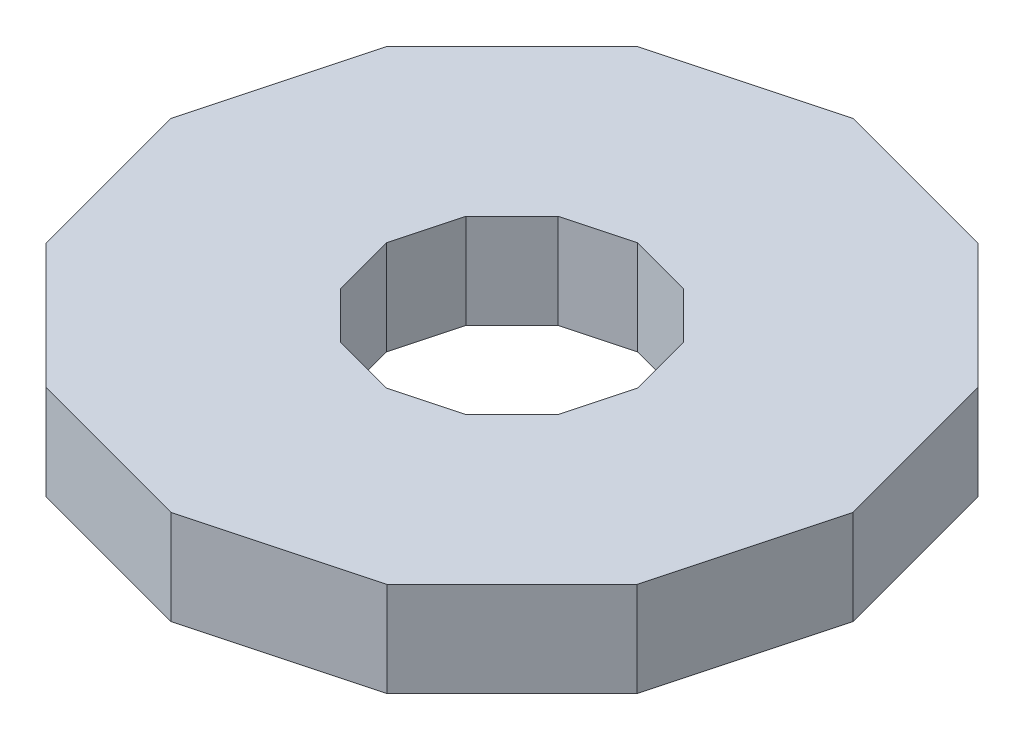
ISO-10303-21;
HEADER;
FILE_DESCRIPTION(('STEP AP214'),'2;1');
FILE_NAME('part.step','',(''),(''),'','','');
FILE_SCHEMA(('AUTOMOTIVE_DESIGN { 1 0 10303 214 1 1 1 1 }'));
ENDSEC;
DATA;
#1=APPLICATION_CONTEXT('core data for automotive mechanical design processes');
#2=APPLICATION_PROTOCOL_DEFINITION('international standard','automotive_design',2000,#1);
#3=PRODUCT_CONTEXT('',#1,'mechanical');
#4=PRODUCT('Part','Part','',(#3));
#5=PRODUCT_RELATED_PRODUCT_CATEGORY('part','',(#4));
#6=PRODUCT_DEFINITION_FORMATION('','',#4);
#7=PRODUCT_DEFINITION_CONTEXT('part definition',#1,'design');
#8=PRODUCT_DEFINITION('design','',#6,#7);
#9=PRODUCT_DEFINITION_SHAPE('','',#8);
#10=(LENGTH_UNIT() NAMED_UNIT(*) SI_UNIT(.MILLI.,.METRE.));
#11=(NAMED_UNIT(*) PLANE_ANGLE_UNIT() SI_UNIT($,.RADIAN.));
#12=(NAMED_UNIT(*) SI_UNIT($,.STERADIAN.) SOLID_ANGLE_UNIT());
#13=UNCERTAINTY_MEASURE_WITH_UNIT(LENGTH_MEASURE(1.E-05),#10,'distance_accuracy_value','');
#14=(GEOMETRIC_REPRESENTATION_CONTEXT(3) GLOBAL_UNCERTAINTY_ASSIGNED_CONTEXT((#13)) GLOBAL_UNIT_ASSIGNED_CONTEXT((#10,
#11,#12)) REPRESENTATION_CONTEXT('',''));
#15=CARTESIAN_POINT('',(0.,0.,0.));
#16=DIRECTION('',(0.,0.,1.));
#17=DIRECTION('',(1.,0.,0.));
#18=AXIS2_PLACEMENT_3D('',#15,#16,#17);
#19=CARTESIAN_POINT('',(0.,19.05,0.));
#20=DIRECTION('',(0.,1.,0.));
#21=DIRECTION('',(0.,0.,1.));
#22=AXIS2_PLACEMENT_3D('',#19,#20,#21);
#23=PLANE('',#22);
#24=DIRECTION('',(0.258819045102521,0.,-0.965925826289068));
#25=VECTOR('',#24,1.);
#26=CARTESIAN_POINT('',(59.4930395218328,19.05,34.3483223828393));
#27=LINE('',#26,#25);
#28=CARTESIAN_POINT('',(59.4930395218328,19.05,34.3483223828393));
#29=VERTEX_POINT('',#28);
#30=CARTESIAN_POINT('',(68.6966447656785,19.05,0.));
#31=VERTEX_POINT('',#30);
#32=EDGE_CURVE('E302',#29,#31,#27,.T.);
#33=ORIENTED_EDGE('',*,*,#32,.T.);
#34=DIRECTION('',(-0.258819045102521,0.,-0.965925826289068));
#35=VECTOR('',#34,1.);
#36=CARTESIAN_POINT('',(68.6966447656785,19.05,0.));
#37=LINE('',#36,#35);
#38=CARTESIAN_POINT('',(59.4930395218328,19.05,-34.3483223828392));
#39=VERTEX_POINT('',#38);
#40=EDGE_CURVE('E306',#31,#39,#37,.T.);
#41=ORIENTED_EDGE('',*,*,#40,.T.);
#42=DIRECTION('',(-0.707106781186548,0.,-0.707106781186547));
#43=VECTOR('',#42,1.);
#44=CARTESIAN_POINT('',(59.4930395218328,19.05,-34.3483223828392));
#45=LINE('',#44,#43);
#46=CARTESIAN_POINT('',(34.3483223828392,19.05,-59.4930395218329));
#47=VERTEX_POINT('',#46);
#48=EDGE_CURVE('E310',#39,#47,#45,.T.);
#49=ORIENTED_EDGE('',*,*,#48,.T.);
#50=DIRECTION('',(-0.965925826289068,0.,-0.258819045102521));
#51=VECTOR('',#50,1.);
#52=CARTESIAN_POINT('',(34.3483223828392,19.05,-59.4930395218329));
#53=LINE('',#52,#51);
#54=CARTESIAN_POINT('',(0.,19.05,-68.6966447656785));
#55=VERTEX_POINT('',#54);
#56=EDGE_CURVE('E313',#47,#55,#53,.T.);
#57=ORIENTED_EDGE('',*,*,#56,.T.);
#58=DIRECTION('',(-0.965925826289068,0.,0.258819045102521));
#59=VECTOR('',#58,1.);
#60=CARTESIAN_POINT('',(0.,19.05,-68.6966447656785));
#61=LINE('',#60,#59);
#62=CARTESIAN_POINT('',(-34.3483223828392,19.05,-59.4930395218328));
#63=VERTEX_POINT('',#62);
#64=EDGE_CURVE('E316',#55,#63,#61,.T.);
#65=ORIENTED_EDGE('',*,*,#64,.T.);
#66=DIRECTION('',(-0.707106781186547,0.,0.707106781186548));
#67=VECTOR('',#66,1.);
#68=CARTESIAN_POINT('',(-34.3483223828392,19.05,-59.4930395218328));
#69=LINE('',#68,#67);
#70=CARTESIAN_POINT('',(-59.4930395218328,19.05,-34.3483223828392));
#71=VERTEX_POINT('',#70);
#72=EDGE_CURVE('E318',#63,#71,#69,.T.);
#73=ORIENTED_EDGE('',*,*,#72,.T.);
#74=DIRECTION('',(-0.258819045102521,0.,0.965925826289068));
#75=VECTOR('',#74,1.);
#76=CARTESIAN_POINT('',(-59.4930395218328,19.05,-34.3483223828392));
#77=LINE('',#76,#75);
#78=CARTESIAN_POINT('',(-68.6966447656785,19.05,0.));
#79=VERTEX_POINT('',#78);
#80=EDGE_CURVE('E321',#71,#79,#77,.T.);
#81=ORIENTED_EDGE('',*,*,#80,.T.);
#82=DIRECTION('',(0.258819045102521,0.,0.965925826289068));
#83=VECTOR('',#82,1.);
#84=CARTESIAN_POINT('',(-68.6966447656785,19.05,0.));
#85=LINE('',#84,#83);
#86=CARTESIAN_POINT('',(-59.4930395218328,19.05,34.3483223828392));
#87=VERTEX_POINT('',#86);
#88=EDGE_CURVE('E324',#79,#87,#85,.T.);
#89=ORIENTED_EDGE('',*,*,#88,.T.);
#90=DIRECTION('',(0.707106781186547,0.,0.707106781186548));
#91=VECTOR('',#90,1.);
#92=CARTESIAN_POINT('',(-59.4930395218328,19.05,34.3483223828392));
#93=LINE('',#92,#91);
#94=CARTESIAN_POINT('',(-34.3483223828392,19.05,59.4930395218328));
#95=VERTEX_POINT('',#94);
#96=EDGE_CURVE('E326',#87,#95,#93,.T.);
#97=ORIENTED_EDGE('',*,*,#96,.T.);
#98=DIRECTION('',(0.965925826289068,0.,0.258819045102521));
#99=VECTOR('',#98,1.);
#100=CARTESIAN_POINT('',(-34.3483223828392,19.05,59.4930395218328));
#101=LINE('',#100,#99);
#102=CARTESIAN_POINT('',(0.,19.05,68.6966447656785));
#103=VERTEX_POINT('',#102);
#104=EDGE_CURVE('E329',#95,#103,#101,.T.);
#105=ORIENTED_EDGE('',*,*,#104,.T.);
#106=DIRECTION('',(0.965925826289068,0.,-0.258819045102521));
#107=VECTOR('',#106,1.);
#108=CARTESIAN_POINT('',(0.,19.05,68.6966447656785));
#109=LINE('',#108,#107);
#110=CARTESIAN_POINT('',(34.3483223828392,19.05,59.4930395218328));
#111=VERTEX_POINT('',#110);
#112=EDGE_CURVE('E331',#103,#111,#109,.T.);
#113=ORIENTED_EDGE('',*,*,#112,.T.);
#114=DIRECTION('',(0.707106781186548,0.,-0.707106781186547));
#115=VECTOR('',#114,1.);
#116=CARTESIAN_POINT('',(34.3483223828392,19.05,59.4930395218328));
#117=LINE('',#116,#115);
#118=EDGE_CURVE('E333',#111,#29,#117,.T.);
#119=ORIENTED_EDGE('',*,*,#118,.T.);
#120=EDGE_LOOP('',(#33,#41,#49,#57,#65,#73,#81,#89,#97,#105,#113,#119));
#121=FACE_BOUND('',#120,.T.);
#122=DIRECTION('',(-0.258819045102521,0.,-0.965925826289068));
#123=VECTOR('',#122,1.);
#124=CARTESIAN_POINT('',(25.3082200446919,19.05,0.));
#125=LINE('',#124,#123);
#126=CARTESIAN_POINT('',(25.3082200446919,19.05,0.));
#127=VERTEX_POINT('',#126);
#128=CARTESIAN_POINT('',(21.9175614832697,19.05,-12.6541100223459));
#129=VERTEX_POINT('',#128);
#130=EDGE_CURVE('E205',#127,#129,#125,.T.);
#131=ORIENTED_EDGE('',*,*,#130,.F.);
#132=DIRECTION('',(0.258819045102521,0.,-0.965925826289068));
#133=VECTOR('',#132,1.);
#134=CARTESIAN_POINT('',(21.9175614832697,19.05,12.6541100223459));
#135=LINE('',#134,#133);
#136=CARTESIAN_POINT('',(21.9175614832697,19.05,12.6541100223459));
#137=VERTEX_POINT('',#136);
#138=EDGE_CURVE('E196',#137,#127,#135,.T.);
#139=ORIENTED_EDGE('',*,*,#138,.F.);
#140=DIRECTION('',(0.707106781186547,0.,-0.707106781186548));
#141=VECTOR('',#140,1.);
#142=CARTESIAN_POINT('',(12.6541100223459,19.05,21.9175614832697));
#143=LINE('',#142,#141);
#144=CARTESIAN_POINT('',(12.6541100223459,19.05,21.9175614832697));
#145=VERTEX_POINT('',#144);
#146=EDGE_CURVE('E239',#145,#137,#143,.T.);
#147=ORIENTED_EDGE('',*,*,#146,.F.);
#148=DIRECTION('',(0.965925826289068,0.,-0.25881904510252));
#149=VECTOR('',#148,1.);
#150=CARTESIAN_POINT('',(0.,19.05,25.3082200446919));
#151=LINE('',#150,#149);
#152=CARTESIAN_POINT('',(0.,19.05,25.3082200446919));
#153=VERTEX_POINT('',#152);
#154=EDGE_CURVE('E237',#153,#145,#151,.T.);
#155=ORIENTED_EDGE('',*,*,#154,.F.);
#156=DIRECTION('',(0.965925826289068,0.,0.258819045102521));
#157=VECTOR('',#156,1.);
#158=CARTESIAN_POINT('',(-12.6541100223459,19.05,21.9175614832697));
#159=LINE('',#158,#157);
#160=CARTESIAN_POINT('',(-12.6541100223459,19.05,21.9175614832697));
#161=VERTEX_POINT('',#160);
#162=EDGE_CURVE('E235',#161,#153,#159,.T.);
#163=ORIENTED_EDGE('',*,*,#162,.F.);
#164=DIRECTION('',(0.707106781186547,0.,0.707106781186548));
#165=VECTOR('',#164,1.);
#166=CARTESIAN_POINT('',(-21.9175614832697,19.05,12.6541100223459));
#167=LINE('',#166,#165);
#168=CARTESIAN_POINT('',(-21.9175614832697,19.05,12.6541100223459));
#169=VERTEX_POINT('',#168);
#170=EDGE_CURVE('E233',#169,#161,#167,.T.);
#171=ORIENTED_EDGE('',*,*,#170,.F.);
#172=DIRECTION('',(0.258819045102521,0.,0.965925826289068));
#173=VECTOR('',#172,1.);
#174=CARTESIAN_POINT('',(-25.3082200446919,19.05,0.));
#175=LINE('',#174,#173);
#176=CARTESIAN_POINT('',(-25.3082200446919,19.05,0.));
#177=VERTEX_POINT('',#176);
#178=EDGE_CURVE('E231',#177,#169,#175,.T.);
#179=ORIENTED_EDGE('',*,*,#178,.F.);
#180=DIRECTION('',(-0.258819045102521,0.,0.965925826289068));
#181=VECTOR('',#180,1.);
#182=CARTESIAN_POINT('',(-21.9175614832697,19.05,-12.6541100223459));
#183=LINE('',#182,#181);
#184=CARTESIAN_POINT('',(-21.9175614832697,19.05,-12.6541100223459));
#185=VERTEX_POINT('',#184);
#186=EDGE_CURVE('E228',#185,#177,#183,.T.);
#187=ORIENTED_EDGE('',*,*,#186,.F.);
#188=DIRECTION('',(-0.707106781186547,0.,0.707106781186548));
#189=VECTOR('',#188,1.);
#190=CARTESIAN_POINT('',(-12.6541100223459,19.05,-21.9175614832697));
#191=LINE('',#190,#189);
#192=CARTESIAN_POINT('',(-12.6541100223459,19.05,-21.9175614832697));
#193=VERTEX_POINT('',#192);
#194=EDGE_CURVE('E226',#193,#185,#191,.T.);
#195=ORIENTED_EDGE('',*,*,#194,.F.);
#196=DIRECTION('',(-0.965925826289068,0.,0.258819045102521));
#197=VECTOR('',#196,1.);
#198=CARTESIAN_POINT('',(0.,19.05,-25.3082200446919));
#199=LINE('',#198,#197);
#200=CARTESIAN_POINT('',(0.,19.05,-25.3082200446919));
#201=VERTEX_POINT('',#200);
#202=EDGE_CURVE('E224',#201,#193,#199,.T.);
#203=ORIENTED_EDGE('',*,*,#202,.F.);
#204=DIRECTION('',(-0.965925826289068,0.,-0.258819045102521));
#205=VECTOR('',#204,1.);
#206=CARTESIAN_POINT('',(12.6541100223459,19.05,-21.9175614832697));
#207=LINE('',#206,#205);
#208=CARTESIAN_POINT('',(12.6541100223459,19.05,-21.9175614832697));
#209=VERTEX_POINT('',#208);
#210=EDGE_CURVE('E220',#209,#201,#207,.T.);
#211=ORIENTED_EDGE('',*,*,#210,.F.);
#212=DIRECTION('',(-0.707106781186548,0.,-0.707106781186547));
#213=VECTOR('',#212,1.);
#214=CARTESIAN_POINT('',(21.9175614832697,19.05,-12.6541100223459));
#215=LINE('',#214,#213);
#216=EDGE_CURVE('E218',#129,#209,#215,.T.);
#217=ORIENTED_EDGE('',*,*,#216,.F.);
#218=EDGE_LOOP('',(#131,#139,#147,#155,#163,#171,#179,#187,#195,#203,#211,#217));
#219=FACE_BOUND('',#218,.T.);
#220=ADVANCED_FACE('F35',(#121,#219),#23,.T.);
#221=CARTESIAN_POINT('',(0.,0.,0.));
#222=DIRECTION('',(0.,1.,0.));
#223=DIRECTION('',(0.,0.,1.));
#224=AXIS2_PLACEMENT_3D('',#221,#222,#223);
#225=PLANE('',#224);
#226=DIRECTION('',(0.258819045102521,0.,-0.965925826289068));
#227=VECTOR('',#226,1.);
#228=CARTESIAN_POINT('',(59.4930395218328,0.,34.3483223828393));
#229=LINE('',#228,#227);
#230=CARTESIAN_POINT('',(59.4930395218328,0.,34.3483223828393));
#231=VERTEX_POINT('',#230);
#232=CARTESIAN_POINT('',(68.6966447656785,0.,0.));
#233=VERTEX_POINT('',#232);
#234=EDGE_CURVE('E213',#231,#233,#229,.T.);
#235=ORIENTED_EDGE('',*,*,#234,.F.);
#236=DIRECTION('',(0.707106781186548,0.,-0.707106781186547));
#237=VECTOR('',#236,1.);
#238=CARTESIAN_POINT('',(34.3483223828392,0.,59.4930395218328));
#239=LINE('',#238,#237);
#240=CARTESIAN_POINT('',(34.3483223828392,0.,59.4930395218328));
#241=VERTEX_POINT('',#240);
#242=EDGE_CURVE('E307',#241,#231,#239,.T.);
#243=ORIENTED_EDGE('',*,*,#242,.F.);
#244=DIRECTION('',(0.965925826289068,0.,-0.258819045102521));
#245=VECTOR('',#244,1.);
#246=CARTESIAN_POINT('',(0.,0.,68.6966447656785));
#247=LINE('',#246,#245);
#248=CARTESIAN_POINT('',(0.,0.,68.6966447656785));
#249=VERTEX_POINT('',#248);
#250=EDGE_CURVE('E358',#249,#241,#247,.T.);
#251=ORIENTED_EDGE('',*,*,#250,.F.);
#252=DIRECTION('',(0.965925826289068,0.,0.258819045102521));
#253=VECTOR('',#252,1.);
#254=CARTESIAN_POINT('',(-34.3483223828392,0.,59.4930395218328));
#255=LINE('',#254,#253);
#256=CARTESIAN_POINT('',(-34.3483223828392,0.,59.4930395218328));
#257=VERTEX_POINT('',#256);
#258=EDGE_CURVE('E355',#257,#249,#255,.T.);
#259=ORIENTED_EDGE('',*,*,#258,.F.);
#260=DIRECTION('',(0.707106781186547,0.,0.707106781186548));
#261=VECTOR('',#260,1.);
#262=CARTESIAN_POINT('',(-59.4930395218328,0.,34.3483223828392));
#263=LINE('',#262,#261);
#264=CARTESIAN_POINT('',(-59.4930395218328,0.,34.3483223828392));
#265=VERTEX_POINT('',#264);
#266=EDGE_CURVE('E353',#265,#257,#263,.T.);
#267=ORIENTED_EDGE('',*,*,#266,.F.);
#268=DIRECTION('',(0.258819045102521,0.,0.965925826289068));
#269=VECTOR('',#268,1.);
#270=CARTESIAN_POINT('',(-68.6966447656785,0.,0.));
#271=LINE('',#270,#269);
#272=CARTESIAN_POINT('',(-68.6966447656785,0.,0.));
#273=VERTEX_POINT('',#272);
#274=EDGE_CURVE('E351',#273,#265,#271,.T.);
#275=ORIENTED_EDGE('',*,*,#274,.F.);
#276=DIRECTION('',(-0.258819045102521,0.,0.965925826289068));
#277=VECTOR('',#276,1.);
#278=CARTESIAN_POINT('',(-59.4930395218328,0.,-34.3483223828392));
#279=LINE('',#278,#277);
#280=CARTESIAN_POINT('',(-59.4930395218328,0.,-34.3483223828392));
#281=VERTEX_POINT('',#280);
#282=EDGE_CURVE('E349',#281,#273,#279,.T.);
#283=ORIENTED_EDGE('',*,*,#282,.F.);
#284=DIRECTION('',(-0.707106781186547,0.,0.707106781186548));
#285=VECTOR('',#284,1.);
#286=CARTESIAN_POINT('',(-34.3483223828392,0.,-59.4930395218328));
#287=LINE('',#286,#285);
#288=CARTESIAN_POINT('',(-34.3483223828392,0.,-59.4930395218328));
#289=VERTEX_POINT('',#288);
#290=EDGE_CURVE('E347',#289,#281,#287,.T.);
#291=ORIENTED_EDGE('',*,*,#290,.F.);
#292=DIRECTION('',(-0.965925826289068,0.,0.258819045102521));
#293=VECTOR('',#292,1.);
#294=CARTESIAN_POINT('',(0.,0.,-68.6966447656785));
#295=LINE('',#294,#293);
#296=CARTESIAN_POINT('',(0.,0.,-68.6966447656785));
#297=VERTEX_POINT('',#296);
#298=EDGE_CURVE('E345',#297,#289,#295,.T.);
#299=ORIENTED_EDGE('',*,*,#298,.F.);
#300=DIRECTION('',(-0.965925826289068,0.,-0.258819045102521));
#301=VECTOR('',#300,1.);
#302=CARTESIAN_POINT('',(34.3483223828392,0.,-59.4930395218329));
#303=LINE('',#302,#301);
#304=CARTESIAN_POINT('',(34.3483223828392,0.,-59.4930395218329));
#305=VERTEX_POINT('',#304);
#306=EDGE_CURVE('E342',#305,#297,#303,.T.);
#307=ORIENTED_EDGE('',*,*,#306,.F.);
#308=DIRECTION('',(-0.707106781186548,0.,-0.707106781186547));
#309=VECTOR('',#308,1.);
#310=CARTESIAN_POINT('',(59.4930395218328,0.,-34.3483223828392));
#311=LINE('',#310,#309);
#312=CARTESIAN_POINT('',(59.4930395218328,0.,-34.3483223828392));
#313=VERTEX_POINT('',#312);
#314=EDGE_CURVE('E340',#313,#305,#311,.T.);
#315=ORIENTED_EDGE('',*,*,#314,.F.);
#316=DIRECTION('',(-0.258819045102521,0.,-0.965925826289068));
#317=VECTOR('',#316,1.);
#318=CARTESIAN_POINT('',(68.6966447656785,0.,0.));
#319=LINE('',#318,#317);
#320=EDGE_CURVE('E338',#233,#313,#319,.T.);
#321=ORIENTED_EDGE('',*,*,#320,.F.);
#322=EDGE_LOOP('',(#235,#243,#251,#259,#267,#275,#283,#291,#299,#307,#315,#321));
#323=FACE_BOUND('',#322,.T.);
#324=DIRECTION('',(0.258819045102521,0.,-0.965925826289068));
#325=VECTOR('',#324,1.);
#326=CARTESIAN_POINT('',(21.9175614832697,0.,12.6541100223459));
#327=LINE('',#326,#325);
#328=CARTESIAN_POINT('',(21.9175614832697,0.,12.6541100223459));
#329=VERTEX_POINT('',#328);
#330=CARTESIAN_POINT('',(25.3082200446919,0.,0.));
#331=VERTEX_POINT('',#330);
#332=EDGE_CURVE('E58',#329,#331,#327,.T.);
#333=ORIENTED_EDGE('',*,*,#332,.T.);
#334=DIRECTION('',(-0.258819045102521,0.,-0.965925826289068));
#335=VECTOR('',#334,1.);
#336=CARTESIAN_POINT('',(25.3082200446919,0.,0.));
#337=LINE('',#336,#335);
#338=CARTESIAN_POINT('',(21.9175614832697,0.,-12.6541100223459));
#339=VERTEX_POINT('',#338);
#340=EDGE_CURVE('E212',#331,#339,#337,.T.);
#341=ORIENTED_EDGE('',*,*,#340,.T.);
#342=DIRECTION('',(-0.707106781186548,0.,-0.707106781186547));
#343=VECTOR('',#342,1.);
#344=CARTESIAN_POINT('',(21.9175614832697,0.,-12.6541100223459));
#345=LINE('',#344,#343);
#346=CARTESIAN_POINT('',(12.6541100223459,0.,-21.9175614832697));
#347=VERTEX_POINT('',#346);
#348=EDGE_CURVE('E245',#339,#347,#345,.T.);
#349=ORIENTED_EDGE('',*,*,#348,.T.);
#350=DIRECTION('',(-0.965925826289068,0.,-0.258819045102521));
#351=VECTOR('',#350,1.);
#352=CARTESIAN_POINT('',(12.6541100223459,0.,-21.9175614832697));
#353=LINE('',#352,#351);
#354=CARTESIAN_POINT('',(0.,0.,-25.3082200446919));
#355=VERTEX_POINT('',#354);
#356=EDGE_CURVE('E249',#347,#355,#353,.T.);
#357=ORIENTED_EDGE('',*,*,#356,.T.);
#358=DIRECTION('',(-0.965925826289068,0.,0.258819045102521));
#359=VECTOR('',#358,1.);
#360=CARTESIAN_POINT('',(0.,0.,-25.3082200446919));
#361=LINE('',#360,#359);
#362=CARTESIAN_POINT('',(-12.6541100223459,0.,-21.9175614832697));
#363=VERTEX_POINT('',#362);
#364=EDGE_CURVE('E253',#355,#363,#361,.T.);
#365=ORIENTED_EDGE('',*,*,#364,.T.);
#366=DIRECTION('',(-0.707106781186547,0.,0.707106781186548));
#367=VECTOR('',#366,1.);
#368=CARTESIAN_POINT('',(-12.6541100223459,0.,-21.9175614832697));
#369=LINE('',#368,#367);
#370=CARTESIAN_POINT('',(-21.9175614832697,0.,-12.6541100223459));
#371=VERTEX_POINT('',#370);
#372=EDGE_CURVE('E257',#363,#371,#369,.T.);
#373=ORIENTED_EDGE('',*,*,#372,.T.);
#374=DIRECTION('',(-0.258819045102521,0.,0.965925826289068));
#375=VECTOR('',#374,1.);
#376=CARTESIAN_POINT('',(-21.9175614832697,0.,-12.6541100223459));
#377=LINE('',#376,#375);
#378=CARTESIAN_POINT('',(-25.3082200446919,0.,0.));
#379=VERTEX_POINT('',#378);
#380=EDGE_CURVE('E261',#371,#379,#377,.T.);
#381=ORIENTED_EDGE('',*,*,#380,.T.);
#382=DIRECTION('',(0.258819045102521,0.,0.965925826289068));
#383=VECTOR('',#382,1.);
#384=CARTESIAN_POINT('',(-25.3082200446919,0.,0.));
#385=LINE('',#384,#383);
#386=CARTESIAN_POINT('',(-21.9175614832697,0.,12.6541100223459));
#387=VERTEX_POINT('',#386);
#388=EDGE_CURVE('E265',#379,#387,#385,.T.);
#389=ORIENTED_EDGE('',*,*,#388,.T.);
#390=DIRECTION('',(0.707106781186547,0.,0.707106781186548));
#391=VECTOR('',#390,1.);
#392=CARTESIAN_POINT('',(-21.9175614832697,0.,12.6541100223459));
#393=LINE('',#392,#391);
#394=CARTESIAN_POINT('',(-12.6541100223459,0.,21.9175614832697));
#395=VERTEX_POINT('',#394);
#396=EDGE_CURVE('E268',#387,#395,#393,.T.);
#397=ORIENTED_EDGE('',*,*,#396,.T.);
#398=DIRECTION('',(0.965925826289068,0.,0.258819045102521));
#399=VECTOR('',#398,1.);
#400=CARTESIAN_POINT('',(-12.6541100223459,0.,21.9175614832697));
#401=LINE('',#400,#399);
#402=CARTESIAN_POINT('',(0.,0.,25.3082200446919));
#403=VERTEX_POINT('',#402);
#404=EDGE_CURVE('E271',#395,#403,#401,.T.);
#405=ORIENTED_EDGE('',*,*,#404,.T.);
#406=DIRECTION('',(0.965925826289068,0.,-0.25881904510252));
#407=VECTOR('',#406,1.);
#408=CARTESIAN_POINT('',(0.,0.,25.3082200446919));
#409=LINE('',#408,#407);
#410=CARTESIAN_POINT('',(12.6541100223459,0.,21.9175614832697));
#411=VERTEX_POINT('',#410);
#412=EDGE_CURVE('E274',#403,#411,#409,.T.);
#413=ORIENTED_EDGE('',*,*,#412,.T.);
#414=DIRECTION('',(0.707106781186547,0.,-0.707106781186548));
#415=VECTOR('',#414,1.);
#416=CARTESIAN_POINT('',(12.6541100223459,0.,21.9175614832697));
#417=LINE('',#416,#415);
#418=EDGE_CURVE('E206',#411,#329,#417,.T.);
#419=ORIENTED_EDGE('',*,*,#418,.T.);
#420=EDGE_LOOP('',(#333,#341,#349,#357,#365,#373,#381,#389,#397,#405,#413,#419));
#421=FACE_BOUND('',#420,.T.);
#422=ADVANCED_FACE('F404',(#323,#421),#225,.F.);
#423=CARTESIAN_POINT('',(59.4930395218328,19.05,34.3483223828393));
#424=DIRECTION('',(-0.965925826289068,0.,-0.258819045102521));
#425=DIRECTION('',(-0.258819045102521,0.,0.965925826289068));
#426=AXIS2_PLACEMENT_3D('',#423,#424,#425);
#427=PLANE('',#426);
#428=ORIENTED_EDGE('',*,*,#234,.T.);
#429=DIRECTION('',(0.,-1.,0.));
#430=VECTOR('',#429,1.);
#431=CARTESIAN_POINT('',(68.6966447656785,19.05,0.));
#432=LINE('',#431,#430);
#433=EDGE_CURVE('E11',#31,#233,#432,.T.);
#434=ORIENTED_EDGE('',*,*,#433,.F.);
#435=ORIENTED_EDGE('',*,*,#32,.F.);
#436=DIRECTION('',(0.,-1.,0.));
#437=VECTOR('',#436,1.);
#438=CARTESIAN_POINT('',(59.4930395218328,19.05,34.3483223828393));
#439=LINE('',#438,#437);
#440=EDGE_CURVE('E335',#29,#231,#439,.T.);
#441=ORIENTED_EDGE('',*,*,#440,.T.);
#442=EDGE_LOOP('',(#428,#434,#435,#441));
#443=FACE_BOUND('',#442,.T.);
#444=ADVANCED_FACE('F37',(#443),#427,.F.);
#445=CARTESIAN_POINT('',(68.6966447656785,19.05,0.));
#446=DIRECTION('',(-0.965925826289068,0.,0.258819045102521));
#447=DIRECTION('',(0.258819045102521,0.,0.965925826289068));
#448=AXIS2_PLACEMENT_3D('',#445,#446,#447);
#449=PLANE('',#448);
#450=ORIENTED_EDGE('',*,*,#320,.T.);
#451=DIRECTION('',(0.,-1.,0.));
#452=VECTOR('',#451,1.);
#453=CARTESIAN_POINT('',(59.4930395218328,19.05,-34.3483223828392));
#454=LINE('',#453,#452);
#455=EDGE_CURVE('E43',#39,#313,#454,.T.);
#456=ORIENTED_EDGE('',*,*,#455,.F.);
#457=ORIENTED_EDGE('',*,*,#40,.F.);
#458=ORIENTED_EDGE('',*,*,#433,.T.);
#459=EDGE_LOOP('',(#450,#456,#457,#458));
#460=FACE_BOUND('',#459,.T.);
#461=ADVANCED_FACE('F421',(#460),#449,.F.);
#462=CARTESIAN_POINT('',(59.4930395218328,19.05,-34.3483223828392));
#463=DIRECTION('',(-0.707106781186547,0.,0.707106781186548));
#464=DIRECTION('',(0.707106781186548,0.,0.707106781186547));
#465=AXIS2_PLACEMENT_3D('',#462,#463,#464);
#466=PLANE('',#465);
#467=ORIENTED_EDGE('',*,*,#314,.T.);
#468=DIRECTION('',(0.,-1.,0.));
#469=VECTOR('',#468,1.);
#470=CARTESIAN_POINT('',(34.3483223828392,19.05,-59.4930395218329));
#471=LINE('',#470,#469);
#472=EDGE_CURVE('E389',#47,#305,#471,.T.);
#473=ORIENTED_EDGE('',*,*,#472,.F.);
#474=ORIENTED_EDGE('',*,*,#48,.F.);
#475=ORIENTED_EDGE('',*,*,#455,.T.);
#476=EDGE_LOOP('',(#467,#473,#474,#475));
#477=FACE_BOUND('',#476,.T.);
#478=ADVANCED_FACE('F398',(#477),#466,.F.);
#479=CARTESIAN_POINT('',(34.3483223828392,19.05,-59.4930395218329));
#480=DIRECTION('',(-0.258819045102521,0.,0.965925826289068));
#481=DIRECTION('',(0.965925826289068,0.,0.258819045102521));
#482=AXIS2_PLACEMENT_3D('',#479,#480,#481);
#483=PLANE('',#482);
#484=ORIENTED_EDGE('',*,*,#306,.T.);
#485=DIRECTION('',(0.,-1.,0.));
#486=VECTOR('',#485,1.);
#487=CARTESIAN_POINT('',(0.,19.05,-68.6966447656785));
#488=LINE('',#487,#486);
#489=EDGE_CURVE('E385',#55,#297,#488,.T.);
#490=ORIENTED_EDGE('',*,*,#489,.F.);
#491=ORIENTED_EDGE('',*,*,#56,.F.);
#492=ORIENTED_EDGE('',*,*,#472,.T.);
#493=EDGE_LOOP('',(#484,#490,#491,#492));
#494=FACE_BOUND('',#493,.T.);
#495=ADVANCED_FACE('F410',(#494),#483,.F.);
#496=CARTESIAN_POINT('',(0.,19.05,-68.6966447656785));
#497=DIRECTION('',(0.258819045102521,0.,0.965925826289068));
#498=DIRECTION('',(0.965925826289068,0.,-0.258819045102521));
#499=AXIS2_PLACEMENT_3D('',#496,#497,#498);
#500=PLANE('',#499);
#501=ORIENTED_EDGE('',*,*,#298,.T.);
#502=DIRECTION('',(0.,-1.,0.));
#503=VECTOR('',#502,1.);
#504=CARTESIAN_POINT('',(-34.3483223828392,19.05,-59.4930395218328));
#505=LINE('',#504,#503);
#506=EDGE_CURVE('E382',#63,#289,#505,.T.);
#507=ORIENTED_EDGE('',*,*,#506,.F.);
#508=ORIENTED_EDGE('',*,*,#64,.F.);
#509=ORIENTED_EDGE('',*,*,#489,.T.);
#510=EDGE_LOOP('',(#501,#507,#508,#509));
#511=FACE_BOUND('',#510,.T.);
#512=ADVANCED_FACE('F414',(#511),#500,.F.);
#513=CARTESIAN_POINT('',(-34.3483223828392,19.05,-59.4930395218328));
#514=DIRECTION('',(0.707106781186548,0.,0.707106781186547));
#515=DIRECTION('',(0.707106781186547,0.,-0.707106781186548));
#516=AXIS2_PLACEMENT_3D('',#513,#514,#515);
#517=PLANE('',#516);
#518=ORIENTED_EDGE('',*,*,#290,.T.);
#519=DIRECTION('',(0.,-1.,0.));
#520=VECTOR('',#519,1.);
#521=CARTESIAN_POINT('',(-59.4930395218328,19.05,-34.3483223828392));
#522=LINE('',#521,#520);
#523=EDGE_CURVE('E379',#71,#281,#522,.T.);
#524=ORIENTED_EDGE('',*,*,#523,.F.);
#525=ORIENTED_EDGE('',*,*,#72,.F.);
#526=ORIENTED_EDGE('',*,*,#506,.T.);
#527=EDGE_LOOP('',(#518,#524,#525,#526));
#528=FACE_BOUND('',#527,.T.);
#529=ADVANCED_FACE('F454',(#528),#517,.F.);
#530=CARTESIAN_POINT('',(-59.4930395218328,19.05,-34.3483223828392));
#531=DIRECTION('',(0.965925826289068,0.,0.258819045102521));
#532=DIRECTION('',(0.258819045102521,0.,-0.965925826289068));
#533=AXIS2_PLACEMENT_3D('',#530,#531,#532);
#534=PLANE('',#533);
#535=ORIENTED_EDGE('',*,*,#282,.T.);
#536=DIRECTION('',(0.,-1.,0.));
#537=VECTOR('',#536,1.);
#538=CARTESIAN_POINT('',(-68.6966447656785,19.05,0.));
#539=LINE('',#538,#537);
#540=EDGE_CURVE('E376',#79,#273,#539,.T.);
#541=ORIENTED_EDGE('',*,*,#540,.F.);
#542=ORIENTED_EDGE('',*,*,#80,.F.);
#543=ORIENTED_EDGE('',*,*,#523,.T.);
#544=EDGE_LOOP('',(#535,#541,#542,#543));
#545=FACE_BOUND('',#544,.T.);
#546=ADVANCED_FACE('F452',(#545),#534,.F.);
#547=CARTESIAN_POINT('',(-68.6966447656785,19.05,0.));
#548=DIRECTION('',(0.965925826289068,0.,-0.258819045102521));
#549=DIRECTION('',(-0.258819045102521,0.,-0.965925826289068));
#550=AXIS2_PLACEMENT_3D('',#547,#548,#549);
#551=PLANE('',#550);
#552=ORIENTED_EDGE('',*,*,#274,.T.);
#553=DIRECTION('',(0.,-1.,0.));
#554=VECTOR('',#553,1.);
#555=CARTESIAN_POINT('',(-59.4930395218328,19.05,34.3483223828392));
#556=LINE('',#555,#554);
#557=EDGE_CURVE('E373',#87,#265,#556,.T.);
#558=ORIENTED_EDGE('',*,*,#557,.F.);
#559=ORIENTED_EDGE('',*,*,#88,.F.);
#560=ORIENTED_EDGE('',*,*,#540,.T.);
#561=EDGE_LOOP('',(#552,#558,#559,#560));
#562=FACE_BOUND('',#561,.T.);
#563=ADVANCED_FACE('F448',(#562),#551,.F.);
#564=CARTESIAN_POINT('',(-59.4930395218328,19.05,34.3483223828392));
#565=DIRECTION('',(0.707106781186548,0.,-0.707106781186547));
#566=DIRECTION('',(-0.707106781186547,0.,-0.707106781186548));
#567=AXIS2_PLACEMENT_3D('',#564,#565,#566);
#568=PLANE('',#567);
#569=ORIENTED_EDGE('',*,*,#266,.T.);
#570=DIRECTION('',(0.,-1.,0.));
#571=VECTOR('',#570,1.);
#572=CARTESIAN_POINT('',(-34.3483223828392,19.05,59.4930395218328));
#573=LINE('',#572,#571);
#574=EDGE_CURVE('E370',#95,#257,#573,.T.);
#575=ORIENTED_EDGE('',*,*,#574,.F.);
#576=ORIENTED_EDGE('',*,*,#96,.F.);
#577=ORIENTED_EDGE('',*,*,#557,.T.);
#578=EDGE_LOOP('',(#569,#575,#576,#577));
#579=FACE_BOUND('',#578,.T.);
#580=ADVANCED_FACE('F443',(#579),#568,.F.);
#581=CARTESIAN_POINT('',(-34.3483223828392,19.05,59.4930395218328));
#582=DIRECTION('',(0.258819045102521,0.,-0.965925826289068));
#583=DIRECTION('',(-0.965925826289068,0.,-0.258819045102521));
#584=AXIS2_PLACEMENT_3D('',#581,#582,#583);
#585=PLANE('',#584);
#586=ORIENTED_EDGE('',*,*,#258,.T.);
#587=DIRECTION('',(0.,-1.,0.));
#588=VECTOR('',#587,1.);
#589=CARTESIAN_POINT('',(0.,19.05,68.6966447656785));
#590=LINE('',#589,#588);
#591=EDGE_CURVE('E366',#103,#249,#590,.T.);
#592=ORIENTED_EDGE('',*,*,#591,.F.);
#593=ORIENTED_EDGE('',*,*,#104,.F.);
#594=ORIENTED_EDGE('',*,*,#574,.T.);
#595=EDGE_LOOP('',(#586,#592,#593,#594));
#596=FACE_BOUND('',#595,.T.);
#597=ADVANCED_FACE('F437',(#596),#585,.F.);
#598=CARTESIAN_POINT('',(0.,19.05,68.6966447656785));
#599=DIRECTION('',(-0.258819045102521,0.,-0.965925826289068));
#600=DIRECTION('',(-0.965925826289068,0.,0.258819045102521));
#601=AXIS2_PLACEMENT_3D('',#598,#599,#600);
#602=PLANE('',#601);
#603=ORIENTED_EDGE('',*,*,#250,.T.);
#604=DIRECTION('',(0.,-1.,0.));
#605=VECTOR('',#604,1.);
#606=CARTESIAN_POINT('',(34.3483223828392,19.05,59.4930395218328));
#607=LINE('',#606,#605);
#608=EDGE_CURVE('E363',#111,#241,#607,.T.);
#609=ORIENTED_EDGE('',*,*,#608,.F.);
#610=ORIENTED_EDGE('',*,*,#112,.F.);
#611=ORIENTED_EDGE('',*,*,#591,.T.);
#612=EDGE_LOOP('',(#603,#609,#610,#611));
#613=FACE_BOUND('',#612,.T.);
#614=ADVANCED_FACE('F433',(#613),#602,.F.);
#615=CARTESIAN_POINT('',(34.3483223828392,19.05,59.4930395218328));
#616=DIRECTION('',(-0.707106781186547,0.,-0.707106781186548));
#617=DIRECTION('',(-0.707106781186548,0.,0.707106781186547));
#618=AXIS2_PLACEMENT_3D('',#615,#616,#617);
#619=PLANE('',#618);
#620=ORIENTED_EDGE('',*,*,#242,.T.);
#621=ORIENTED_EDGE('',*,*,#440,.F.);
#622=ORIENTED_EDGE('',*,*,#118,.F.);
#623=ORIENTED_EDGE('',*,*,#608,.T.);
#624=EDGE_LOOP('',(#620,#621,#622,#623));
#625=FACE_BOUND('',#624,.T.);
#626=ADVANCED_FACE('F428',(#625),#619,.F.);
#627=CARTESIAN_POINT('',(21.9175614832697,19.05,12.6541100223459));
#628=DIRECTION('',(-0.965925826289068,0.,-0.258819045102521));
#629=DIRECTION('',(-0.258819045102521,0.,0.965925826289068));
#630=AXIS2_PLACEMENT_3D('',#627,#628,#629);
#631=PLANE('',#630);
#632=ORIENTED_EDGE('',*,*,#332,.F.);
#633=DIRECTION('',(0.,-1.,0.));
#634=VECTOR('',#633,1.);
#635=CARTESIAN_POINT('',(21.9175614832697,19.05,12.6541100223459));
#636=LINE('',#635,#634);
#637=EDGE_CURVE('E200',#137,#329,#636,.T.);
#638=ORIENTED_EDGE('',*,*,#637,.F.);
#639=ORIENTED_EDGE('',*,*,#138,.T.);
#640=DIRECTION('',(0.,-1.,0.));
#641=VECTOR('',#640,1.);
#642=CARTESIAN_POINT('',(25.3082200446919,19.05,0.));
#643=LINE('',#642,#641);
#644=EDGE_CURVE('E199',#127,#331,#643,.T.);
#645=ORIENTED_EDGE('',*,*,#644,.T.);
#646=EDGE_LOOP('',(#632,#638,#639,#645));
#647=FACE_BOUND('',#646,.T.);
#648=ADVANCED_FACE('F198',(#647),#631,.T.);
#649=CARTESIAN_POINT('',(25.3082200446919,19.05,0.));
#650=DIRECTION('',(-0.965925826289068,0.,0.258819045102521));
#651=DIRECTION('',(0.258819045102521,0.,0.965925826289068));
#652=AXIS2_PLACEMENT_3D('',#649,#650,#651);
#653=PLANE('',#652);
#654=ORIENTED_EDGE('',*,*,#340,.F.);
#655=ORIENTED_EDGE('',*,*,#644,.F.);
#656=ORIENTED_EDGE('',*,*,#130,.T.);
#657=DIRECTION('',(0.,-1.,0.));
#658=VECTOR('',#657,1.);
#659=CARTESIAN_POINT('',(21.9175614832697,19.05,-12.6541100223459));
#660=LINE('',#659,#658);
#661=EDGE_CURVE('E214',#129,#339,#660,.T.);
#662=ORIENTED_EDGE('',*,*,#661,.T.);
#663=EDGE_LOOP('',(#654,#655,#656,#662));
#664=FACE_BOUND('',#663,.T.);
#665=ADVANCED_FACE('F209',(#664),#653,.T.);
#666=CARTESIAN_POINT('',(21.9175614832697,19.05,-12.6541100223459));
#667=DIRECTION('',(-0.707106781186547,0.,0.707106781186548));
#668=DIRECTION('',(0.707106781186548,0.,0.707106781186547));
#669=AXIS2_PLACEMENT_3D('',#666,#667,#668);
#670=PLANE('',#669);
#671=ORIENTED_EDGE('',*,*,#348,.F.);
#672=ORIENTED_EDGE('',*,*,#661,.F.);
#673=ORIENTED_EDGE('',*,*,#216,.T.);
#674=DIRECTION('',(0.,-1.,0.));
#675=VECTOR('',#674,1.);
#676=CARTESIAN_POINT('',(12.6541100223459,19.05,-21.9175614832697));
#677=LINE('',#676,#675);
#678=EDGE_CURVE('E298',#209,#347,#677,.T.);
#679=ORIENTED_EDGE('',*,*,#678,.T.);
#680=EDGE_LOOP('',(#671,#672,#673,#679));
#681=FACE_BOUND('',#680,.T.);
#682=ADVANCED_FACE('F512',(#681),#670,.T.);
#683=CARTESIAN_POINT('',(12.6541100223459,19.05,-21.9175614832697));
#684=DIRECTION('',(-0.258819045102521,0.,0.965925826289068));
#685=DIRECTION('',(0.965925826289068,0.,0.258819045102521));
#686=AXIS2_PLACEMENT_3D('',#683,#684,#685);
#687=PLANE('',#686);
#688=ORIENTED_EDGE('',*,*,#356,.F.);
#689=ORIENTED_EDGE('',*,*,#678,.F.);
#690=ORIENTED_EDGE('',*,*,#210,.T.);
#691=DIRECTION('',(0.,-1.,0.));
#692=VECTOR('',#691,1.);
#693=CARTESIAN_POINT('',(0.,19.05,-25.3082200446919));
#694=LINE('',#693,#692);
#695=EDGE_CURVE('E295',#201,#355,#694,.T.);
#696=ORIENTED_EDGE('',*,*,#695,.T.);
#697=EDGE_LOOP('',(#688,#689,#690,#696));
#698=FACE_BOUND('',#697,.T.);
#699=ADVANCED_FACE('F518',(#698),#687,.T.);
#700=CARTESIAN_POINT('',(0.,19.05,-25.3082200446919));
#701=DIRECTION('',(0.258819045102521,0.,0.965925826289068));
#702=DIRECTION('',(0.965925826289068,0.,-0.258819045102521));
#703=AXIS2_PLACEMENT_3D('',#700,#701,#702);
#704=PLANE('',#703);
#705=ORIENTED_EDGE('',*,*,#364,.F.);
#706=ORIENTED_EDGE('',*,*,#695,.F.);
#707=ORIENTED_EDGE('',*,*,#202,.T.);
#708=DIRECTION('',(0.,-1.,0.));
#709=VECTOR('',#708,1.);
#710=CARTESIAN_POINT('',(-12.6541100223459,19.05,-21.9175614832697));
#711=LINE('',#710,#709);
#712=EDGE_CURVE('E292',#193,#363,#711,.T.);
#713=ORIENTED_EDGE('',*,*,#712,.T.);
#714=EDGE_LOOP('',(#705,#706,#707,#713));
#715=FACE_BOUND('',#714,.T.);
#716=ADVANCED_FACE('F526',(#715),#704,.T.);
#717=CARTESIAN_POINT('',(-12.6541100223459,19.05,-21.9175614832697));
#718=DIRECTION('',(0.707106781186548,0.,0.707106781186547));
#719=DIRECTION('',(0.707106781186547,0.,-0.707106781186548));
#720=AXIS2_PLACEMENT_3D('',#717,#718,#719);
#721=PLANE('',#720);
#722=ORIENTED_EDGE('',*,*,#372,.F.);
#723=ORIENTED_EDGE('',*,*,#712,.F.);
#724=ORIENTED_EDGE('',*,*,#194,.T.);
#725=DIRECTION('',(0.,-1.,0.));
#726=VECTOR('',#725,1.);
#727=CARTESIAN_POINT('',(-21.9175614832697,19.05,-12.6541100223459));
#728=LINE('',#727,#726);
#729=EDGE_CURVE('E290',#185,#371,#728,.T.);
#730=ORIENTED_EDGE('',*,*,#729,.T.);
#731=EDGE_LOOP('',(#722,#723,#724,#730));
#732=FACE_BOUND('',#731,.T.);
#733=ADVANCED_FACE('F534',(#732),#721,.T.);
#734=CARTESIAN_POINT('',(-21.9175614832697,19.05,-12.6541100223459));
#735=DIRECTION('',(0.965925826289068,0.,0.258819045102521));
#736=DIRECTION('',(0.258819045102521,0.,-0.965925826289068));
#737=AXIS2_PLACEMENT_3D('',#734,#735,#736);
#738=PLANE('',#737);
#739=ORIENTED_EDGE('',*,*,#380,.F.);
#740=ORIENTED_EDGE('',*,*,#729,.F.);
#741=ORIENTED_EDGE('',*,*,#186,.T.);
#742=DIRECTION('',(0.,-1.,0.));
#743=VECTOR('',#742,1.);
#744=CARTESIAN_POINT('',(-25.3082200446919,19.05,0.));
#745=LINE('',#744,#743);
#746=EDGE_CURVE('E288',#177,#379,#745,.T.);
#747=ORIENTED_EDGE('',*,*,#746,.T.);
#748=EDGE_LOOP('',(#739,#740,#741,#747));
#749=FACE_BOUND('',#748,.T.);
#750=ADVANCED_FACE('F542',(#749),#738,.T.);
#751=CARTESIAN_POINT('',(-25.3082200446919,19.05,0.));
#752=DIRECTION('',(0.965925826289068,0.,-0.258819045102521));
#753=DIRECTION('',(-0.258819045102521,0.,-0.965925826289068));
#754=AXIS2_PLACEMENT_3D('',#751,#752,#753);
#755=PLANE('',#754);
#756=ORIENTED_EDGE('',*,*,#388,.F.);
#757=ORIENTED_EDGE('',*,*,#746,.F.);
#758=ORIENTED_EDGE('',*,*,#178,.T.);
#759=DIRECTION('',(0.,-1.,0.));
#760=VECTOR('',#759,1.);
#761=CARTESIAN_POINT('',(-21.9175614832697,19.05,12.6541100223459));
#762=LINE('',#761,#760);
#763=EDGE_CURVE('E286',#169,#387,#762,.T.);
#764=ORIENTED_EDGE('',*,*,#763,.T.);
#765=EDGE_LOOP('',(#756,#757,#758,#764));
#766=FACE_BOUND('',#765,.T.);
#767=ADVANCED_FACE('F550',(#766),#755,.T.);
#768=CARTESIAN_POINT('',(-21.9175614832697,19.05,12.6541100223459));
#769=DIRECTION('',(0.707106781186548,0.,-0.707106781186547));
#770=DIRECTION('',(-0.707106781186547,0.,-0.707106781186548));
#771=AXIS2_PLACEMENT_3D('',#768,#769,#770);
#772=PLANE('',#771);
#773=ORIENTED_EDGE('',*,*,#396,.F.);
#774=ORIENTED_EDGE('',*,*,#763,.F.);
#775=ORIENTED_EDGE('',*,*,#170,.T.);
#776=DIRECTION('',(0.,-1.,0.));
#777=VECTOR('',#776,1.);
#778=CARTESIAN_POINT('',(-12.6541100223459,19.05,21.9175614832697));
#779=LINE('',#778,#777);
#780=EDGE_CURVE('E284',#161,#395,#779,.T.);
#781=ORIENTED_EDGE('',*,*,#780,.T.);
#782=EDGE_LOOP('',(#773,#774,#775,#781));
#783=FACE_BOUND('',#782,.T.);
#784=ADVANCED_FACE('F558',(#783),#772,.T.);
#785=CARTESIAN_POINT('',(-12.6541100223459,19.05,21.9175614832697));
#786=DIRECTION('',(0.258819045102521,0.,-0.965925826289068));
#787=DIRECTION('',(-0.965925826289068,0.,-0.258819045102521));
#788=AXIS2_PLACEMENT_3D('',#785,#786,#787);
#789=PLANE('',#788);
#790=ORIENTED_EDGE('',*,*,#404,.F.);
#791=ORIENTED_EDGE('',*,*,#780,.F.);
#792=ORIENTED_EDGE('',*,*,#162,.T.);
#793=DIRECTION('',(0.,-1.,0.));
#794=VECTOR('',#793,1.);
#795=CARTESIAN_POINT('',(0.,19.05,25.3082200446919));
#796=LINE('',#795,#794);
#797=EDGE_CURVE('E282',#153,#403,#796,.T.);
#798=ORIENTED_EDGE('',*,*,#797,.T.);
#799=EDGE_LOOP('',(#790,#791,#792,#798));
#800=FACE_BOUND('',#799,.T.);
#801=ADVANCED_FACE('F566',(#800),#789,.T.);
#802=CARTESIAN_POINT('',(0.,19.05,25.3082200446919));
#803=DIRECTION('',(-0.258819045102521,0.,-0.965925826289068));
#804=DIRECTION('',(-0.965925826289068,0.,0.258819045102521));
#805=AXIS2_PLACEMENT_3D('',#802,#803,#804);
#806=PLANE('',#805);
#807=ORIENTED_EDGE('',*,*,#412,.F.);
#808=ORIENTED_EDGE('',*,*,#797,.F.);
#809=ORIENTED_EDGE('',*,*,#154,.T.);
#810=DIRECTION('',(0.,-1.,0.));
#811=VECTOR('',#810,1.);
#812=CARTESIAN_POINT('',(12.6541100223459,19.05,21.9175614832697));
#813=LINE('',#812,#811);
#814=EDGE_CURVE('E50',#145,#411,#813,.T.);
#815=ORIENTED_EDGE('',*,*,#814,.T.);
#816=EDGE_LOOP('',(#807,#808,#809,#815));
#817=FACE_BOUND('',#816,.T.);
#818=ADVANCED_FACE('F574',(#817),#806,.T.);
#819=CARTESIAN_POINT('',(12.6541100223459,19.05,21.9175614832697));
#820=DIRECTION('',(-0.707106781186548,0.,-0.707106781186547));
#821=DIRECTION('',(-0.707106781186547,0.,0.707106781186548));
#822=AXIS2_PLACEMENT_3D('',#819,#820,#821);
#823=PLANE('',#822);
#824=ORIENTED_EDGE('',*,*,#418,.F.);
#825=ORIENTED_EDGE('',*,*,#814,.F.);
#826=ORIENTED_EDGE('',*,*,#146,.T.);
#827=ORIENTED_EDGE('',*,*,#637,.T.);
#828=EDGE_LOOP('',(#824,#825,#826,#827));
#829=FACE_BOUND('',#828,.T.);
#830=ADVANCED_FACE('F582',(#829),#823,.T.);
#831=CLOSED_SHELL('',(#220,#422,#444,#461,#478,#495,#512,#529,#546,#563,#580,#597,#614,#626,
#648,#665,#682,#699,#716,#733,#750,#767,#784,#801,#818,#830));
#832=MANIFOLD_SOLID_BREP('B2',#831);
#833=ADVANCED_BREP_SHAPE_REPRESENTATION('',(#18,#832),#14);
#834=SHAPE_DEFINITION_REPRESENTATION(#9,#833);
ENDSEC;
END-ISO-10303-21;
